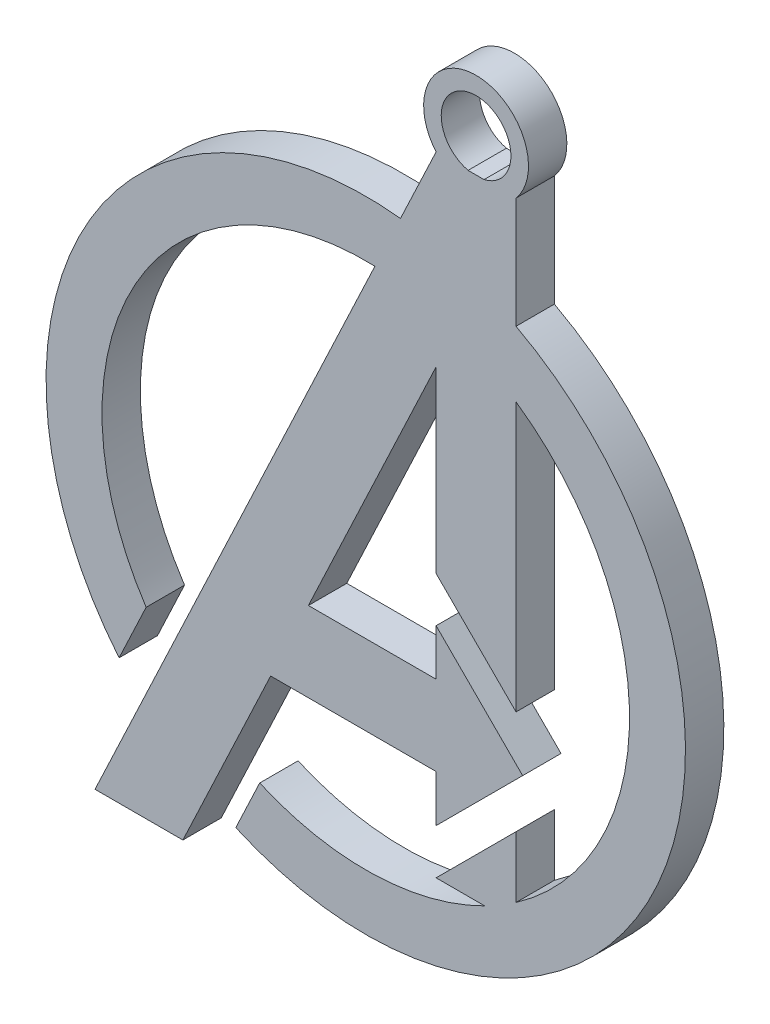
ISO-10303-21;
HEADER;
FILE_DESCRIPTION(('STEP AP214'),'2;1');
FILE_NAME('part.step','',(''),(''),'','','');
FILE_SCHEMA(('AUTOMOTIVE_DESIGN { 1 0 10303 214 1 1 1 1 }'));
ENDSEC;
DATA;
#1=APPLICATION_CONTEXT('core data for automotive mechanical design processes');
#2=APPLICATION_PROTOCOL_DEFINITION('international standard','automotive_design',2000,#1);
#3=PRODUCT_CONTEXT('',#1,'mechanical');
#4=PRODUCT('Part','Part','',(#3));
#5=PRODUCT_RELATED_PRODUCT_CATEGORY('part','',(#4));
#6=PRODUCT_DEFINITION_FORMATION('','',#4);
#7=PRODUCT_DEFINITION_CONTEXT('part definition',#1,'design');
#8=PRODUCT_DEFINITION('design','',#6,#7);
#9=PRODUCT_DEFINITION_SHAPE('','',#8);
#10=(LENGTH_UNIT() NAMED_UNIT(*) SI_UNIT(.MILLI.,.METRE.));
#11=(NAMED_UNIT(*) PLANE_ANGLE_UNIT() SI_UNIT($,.RADIAN.));
#12=(NAMED_UNIT(*) SI_UNIT($,.STERADIAN.) SOLID_ANGLE_UNIT());
#13=UNCERTAINTY_MEASURE_WITH_UNIT(LENGTH_MEASURE(1.E-05),#10,'distance_accuracy_value','');
#14=(GEOMETRIC_REPRESENTATION_CONTEXT(3) GLOBAL_UNCERTAINTY_ASSIGNED_CONTEXT((#13)) GLOBAL_UNIT_ASSIGNED_CONTEXT((#10,
#11,#12)) REPRESENTATION_CONTEXT('',''));
#15=CARTESIAN_POINT('',(0.,0.,0.));
#16=DIRECTION('',(0.,0.,1.));
#17=DIRECTION('',(1.,0.,0.));
#18=AXIS2_PLACEMENT_3D('',#15,#16,#17);
#19=CARTESIAN_POINT('',(5.588,31.242,3.048));
#20=DIRECTION('',(0.,-1.,0.));
#21=DIRECTION('',(0.,0.,-1.));
#22=AXIS2_PLACEMENT_3D('',#19,#20,#21);
#23=PLANE('',#22);
#24=DIRECTION('',(0.,0.,-1.));
#25=VECTOR('',#24,1.);
#26=CARTESIAN_POINT('',(8.128,31.242,3.048));
#27=LINE('',#26,#25);
#28=CARTESIAN_POINT('',(8.128,31.242,3.048));
#29=VERTEX_POINT('',#28);
#30=CARTESIAN_POINT('',(8.128,31.242,0.));
#31=VERTEX_POINT('',#30);
#32=EDGE_CURVE('E464',#29,#31,#27,.T.);
#33=ORIENTED_EDGE('',*,*,#32,.F.);
#34=DIRECTION('',(-1.,0.,0.));
#35=VECTOR('',#34,1.);
#36=CARTESIAN_POINT('',(5.588,31.242,3.048));
#37=LINE('',#36,#35);
#38=CARTESIAN_POINT('',(9.398,31.242,3.048));
#39=VERTEX_POINT('',#38);
#40=EDGE_CURVE('E79',#39,#29,#37,.T.);
#41=ORIENTED_EDGE('',*,*,#40,.F.);
#42=DIRECTION('',(0.,0.,-1.));
#43=VECTOR('',#42,1.);
#44=CARTESIAN_POINT('',(9.39799999999999,31.242,3.048));
#45=LINE('',#44,#43);
#46=CARTESIAN_POINT('',(9.39799999999999,31.242,0.));
#47=VERTEX_POINT('',#46);
#48=EDGE_CURVE('E467',#39,#47,#45,.T.);
#49=ORIENTED_EDGE('',*,*,#48,.T.);
#50=DIRECTION('',(-1.,0.,0.));
#51=VECTOR('',#50,1.);
#52=CARTESIAN_POINT('',(5.588,31.242,0.));
#53=LINE('',#52,#51);
#54=EDGE_CURVE('E319',#47,#31,#53,.T.);
#55=ORIENTED_EDGE('',*,*,#54,.T.);
#56=EDGE_LOOP('',(#33,#41,#49,#55));
#57=FACE_BOUND('',#56,.T.);
#58=ADVANCED_FACE('F64',(#57),#23,.F.);
#59=CARTESIAN_POINT('',(0.,0.,3.048));
#60=DIRECTION('',(0.,0.,1.));
#61=DIRECTION('',(1.,0.,0.));
#62=AXIS2_PLACEMENT_3D('',#59,#60,#61);
#63=PLANE('',#62);
#64=ORIENTED_EDGE('',*,*,#40,.T.);
#65=CARTESIAN_POINT('',(8.763,33.9375499521396,3.048));
#66=DIRECTION('',(0.,0.,-1.));
#67=DIRECTION('',(-1.,0.,0.));
#68=AXIS2_PLACEMENT_3D('',#65,#66,#67);
#69=CIRCLE('',#68,2.76933467541935);
#70=EDGE_CURVE('E263',#29,#39,#69,.T.);
#71=ORIENTED_EDGE('',*,*,#70,.T.);
#72=EDGE_LOOP('',(#64,#71));
#73=FACE_BOUND('',#72,.T.);
#74=DIRECTION('',(-0.42688750774078,-0.904304736101092,0.));
#75=VECTOR('',#74,1.);
#76=CARTESIAN_POINT('',(5.588,31.242,3.048));
#77=LINE('',#76,#75);
#78=CARTESIAN_POINT('',(0.725964665707497,20.9424210707393,3.048));
#79=VERTEX_POINT('',#78);
#80=CARTESIAN_POINT('',(-21.5102219998152,-26.162,3.048));
#81=VERTEX_POINT('',#80);
#82=EDGE_CURVE('E280',#79,#81,#77,.T.);
#83=ORIENTED_EDGE('',*,*,#82,.T.);
#84=DIRECTION('',(-1.,0.,0.));
#85=VECTOR('',#84,1.);
#86=CARTESIAN_POINT('',(2.64811640183988E-13,-26.162,3.048));
#87=LINE('',#86,#85);
#88=CARTESIAN_POINT('',(-14.5290928162455,-26.162,3.048));
#89=VERTEX_POINT('',#88);
#90=EDGE_CURVE('E461',#89,#81,#87,.T.);
#91=ORIENTED_EDGE('',*,*,#90,.F.);
#92=DIRECTION('',(0.42688750774078,0.904304736101092,0.));
#93=VECTOR('',#92,1.);
#94=CARTESIAN_POINT('',(11.2969374581526,28.5470300567194,3.048));
#95=LINE('',#94,#93);
#96=CARTESIAN_POINT('',(-7.55518868895668,-11.3887062936595,3.048));
#97=VERTEX_POINT('',#96);
#98=EDGE_CURVE('E87',#89,#97,#95,.T.);
#99=ORIENTED_EDGE('',*,*,#98,.T.);
#100=DIRECTION('',(-1.,0.,0.));
#101=VECTOR('',#100,1.);
#102=CARTESIAN_POINT('',(5.588,-11.3887062936595,3.048));
#103=LINE('',#102,#101);
#104=CARTESIAN_POINT('',(5.588,-11.3887062936595,3.048));
#105=VERTEX_POINT('',#104);
#106=EDGE_CURVE('E426',#105,#97,#103,.T.);
#107=ORIENTED_EDGE('',*,*,#106,.F.);
#108=DIRECTION('',(0.,1.,0.));
#109=VECTOR('',#108,1.);
#110=CARTESIAN_POINT('',(5.588,0.,3.048));
#111=LINE('',#110,#109);
#112=CARTESIAN_POINT('',(5.588,-15.1107057144656,3.048));
#113=VERTEX_POINT('',#112);
#114=EDGE_CURVE('E457',#113,#105,#111,.T.);
#115=ORIENTED_EDGE('',*,*,#114,.F.);
#116=DIRECTION('',(-0.707106781186547,-0.707106781186548,0.));
#117=VECTOR('',#116,1.);
#118=CARTESIAN_POINT('',(10.3493528572328,-10.3493528572328,3.048));
#119=LINE('',#118,#117);
#120=CARTESIAN_POINT('',(12.4654997104031,-8.23320600406252,3.048));
#121=VERTEX_POINT('',#120);
#122=EDGE_CURVE('E454',#121,#113,#119,.T.);
#123=ORIENTED_EDGE('',*,*,#122,.F.);
#124=DIRECTION('',(0.707106781186548,-0.707106781186548,0.));
#125=VECTOR('',#124,1.);
#126=CARTESIAN_POINT('',(2.11614685317027,2.11614685317027,3.048));
#127=LINE('',#126,#125);
#128=CARTESIAN_POINT('',(5.588,-1.35570629365946,3.048));
#129=VERTEX_POINT('',#128);
#130=EDGE_CURVE('E441',#129,#121,#127,.T.);
#131=ORIENTED_EDGE('',*,*,#130,.F.);
#132=CARTESIAN_POINT('',(5.588,-5.03870629365946,3.048));
#133=VERTEX_POINT('',#132);
#134=EDGE_CURVE('E445',#133,#129,#111,.T.);
#135=ORIENTED_EDGE('',*,*,#134,.F.);
#136=DIRECTION('',(-1.,0.,0.));
#137=VECTOR('',#136,1.);
#138=CARTESIAN_POINT('',(5.588,-5.03870629365946,3.048));
#139=LINE('',#138,#137);
#140=CARTESIAN_POINT('',(-4.55759775977358,-5.03870629365947,3.048));
#141=VERTEX_POINT('',#140);
#142=EDGE_CURVE('E418',#133,#141,#139,.T.);
#143=ORIENTED_EDGE('',*,*,#142,.T.);
#144=CARTESIAN_POINT('',(5.588,16.4534009673266,3.048));
#145=VERTEX_POINT('',#144);
#146=EDGE_CURVE('E279',#141,#145,#95,.T.);
#147=ORIENTED_EDGE('',*,*,#146,.T.);
#148=DIRECTION('',(0.,-1.,0.));
#149=VECTOR('',#148,1.);
#150=CARTESIAN_POINT('',(5.588,31.242,3.048));
#151=LINE('',#150,#149);
#152=CARTESIAN_POINT('',(5.588,2.2363961547682,3.048));
#153=VERTEX_POINT('',#152);
#154=EDGE_CURVE('E315',#145,#153,#151,.T.);
#155=ORIENTED_EDGE('',*,*,#154,.T.);
#156=DIRECTION('',(0.707106781186542,-0.707106781186553,0.));
#157=VECTOR('',#156,1.);
#158=CARTESIAN_POINT('',(5.588,2.2363961547682,3.048));
#159=LINE('',#158,#157);
#160=CARTESIAN_POINT('',(11.938,-4.11360384523191,3.048));
#161=VERTEX_POINT('',#160);
#162=EDGE_CURVE('E402',#153,#161,#159,.T.);
#163=ORIENTED_EDGE('',*,*,#162,.T.);
#164=DIRECTION('',(0.,1.,0.));
#165=VECTOR('',#164,1.);
#166=CARTESIAN_POINT('',(11.938,31.242,3.048));
#167=LINE('',#166,#165);
#168=CARTESIAN_POINT('',(11.938,17.2219679769764,3.048));
#169=VERTEX_POINT('',#168);
#170=EDGE_CURVE('E323',#161,#169,#167,.T.);
#171=ORIENTED_EDGE('',*,*,#170,.T.);
#172=CARTESIAN_POINT('',(0.,0.,3.048));
#173=DIRECTION('',(0.,0.,1.));
#174=DIRECTION('',(1.,0.,0.));
#175=AXIS2_PLACEMENT_3D('',#172,#173,#174);
#176=CIRCLE('',#175,20.955);
#177=CARTESIAN_POINT('',(11.938,-17.2219679769764,3.048));
#178=VERTEX_POINT('',#177);
#179=EDGE_CURVE('E345',#178,#169,#176,.T.);
#180=ORIENTED_EDGE('',*,*,#179,.F.);
#181=CARTESIAN_POINT('',(11.938,-12.3528081628932,3.048));
#182=VERTEX_POINT('',#181);
#183=EDGE_CURVE('E324',#178,#182,#167,.T.);
#184=ORIENTED_EDGE('',*,*,#183,.T.);
#185=DIRECTION('',(-0.707106781186553,-0.707106781186542,0.));
#186=VECTOR('',#185,1.);
#187=CARTESIAN_POINT('',(16.0576021588306,-8.23320600406261,3.048));
#188=LINE('',#187,#186);
#189=CARTESIAN_POINT('',(5.588,-18.7028081628931,3.048));
#190=VERTEX_POINT('',#189);
#191=EDGE_CURVE('E404',#182,#190,#188,.T.);
#192=ORIENTED_EDGE('',*,*,#191,.T.);
#193=DIRECTION('',(1.,0.,0.));
#194=VECTOR('',#193,1.);
#195=CARTESIAN_POINT('',(5.588,-18.7028081628931,3.048));
#196=LINE('',#195,#194);
#197=CARTESIAN_POINT('',(9.45076673196521,-18.7028081628931,3.048));
#198=VERTEX_POINT('',#197);
#199=EDGE_CURVE('E318',#190,#198,#196,.T.);
#200=ORIENTED_EDGE('',*,*,#199,.T.);
#201=CARTESIAN_POINT('',(-8.42711876384841,-19.1858201372783,3.048));
#202=VERTEX_POINT('',#201);
#203=EDGE_CURVE('E348',#202,#198,#176,.T.);
#204=ORIENTED_EDGE('',*,*,#203,.F.);
#205=DIRECTION('',(0.426887507740779,0.904304736101092,0.));
#206=VECTOR('',#205,1.);
#207=CARTESIAN_POINT('',(0.515004741694176,-0.243113943651771,3.048));
#208=LINE('',#207,#206);
#209=CARTESIAN_POINT('',(-10.3252121349415,-23.2066799514376,3.048));
#210=VERTEX_POINT('',#209);
#211=EDGE_CURVE('E307',#210,#202,#208,.T.);
#212=ORIENTED_EDGE('',*,*,#211,.F.);
#213=CARTESIAN_POINT('',(0.,0.,3.048));
#214=DIRECTION('',(0.,0.,1.));
#215=DIRECTION('',(1.,0.,0.));
#216=AXIS2_PLACEMENT_3D('',#213,#214,#215);
#217=CIRCLE('',#216,25.4);
#218=CARTESIAN_POINT('',(11.938,22.4197269385691,3.048));
#219=VERTEX_POINT('',#218);
#220=EDGE_CURVE('E357',#210,#219,#217,.T.);
#221=ORIENTED_EDGE('',*,*,#220,.T.);
#222=CARTESIAN_POINT('',(11.938,31.242,3.048));
#223=VERTEX_POINT('',#222);
#224=EDGE_CURVE('E259',#219,#223,#167,.T.);
#225=ORIENTED_EDGE('',*,*,#224,.T.);
#226=CARTESIAN_POINT('',(8.763,33.9375499521396,3.048));
#227=DIRECTION('',(0.,0.,1.));
#228=DIRECTION('',(-1.,0.,0.));
#229=AXIS2_PLACEMENT_3D('',#226,#227,#228);
#230=CIRCLE('',#229,4.16492671537928);
#231=CARTESIAN_POINT('',(5.588,31.242,3.048));
#232=VERTEX_POINT('',#231);
#233=EDGE_CURVE('E252',#223,#232,#230,.T.);
#234=ORIENTED_EDGE('',*,*,#233,.T.);
#235=CARTESIAN_POINT('',(2.7592575260228,25.2496831248451,3.048));
#236=VERTEX_POINT('',#235);
#237=EDGE_CURVE('E257',#232,#236,#77,.T.);
#238=ORIENTED_EDGE('',*,*,#237,.T.);
#239=CARTESIAN_POINT('',(-19.5970259534367,-16.1591018865632,3.048));
#240=VERTEX_POINT('',#239);
#241=EDGE_CURVE('E354',#236,#240,#217,.T.);
#242=ORIENTED_EDGE('',*,*,#241,.T.);
#243=DIRECTION('',(0.42688750774078,0.904304736101092,0.));
#244=VECTOR('',#243,1.);
#245=CARTESIAN_POINT('',(-9.78780077585193,4.62044453895197,3.048));
#246=LINE('',#245,#244);
#247=CARTESIAN_POINT('',(-17.4475768457148,-11.6057781821331,3.048));
#248=VERTEX_POINT('',#247);
#249=EDGE_CURVE('E298',#240,#248,#246,.T.);
#250=ORIENTED_EDGE('',*,*,#249,.T.);
#251=EDGE_CURVE('E350',#79,#248,#176,.T.);
#252=ORIENTED_EDGE('',*,*,#251,.F.);
#253=EDGE_LOOP('',(#83,#91,#99,#107,#115,#123,#131,#135,#143,#147,#155,#163,#171,#180,#184,#192,
#200,#204,#212,#221,#225,#234,#238,#242,#250,#252));
#254=FACE_BOUND('',#253,.T.);
#255=ADVANCED_FACE('F255',(#73,#254),#63,.T.);
#256=CARTESIAN_POINT('',(0.,0.,0.));
#257=DIRECTION('',(0.,0.,1.));
#258=DIRECTION('',(1.,0.,0.));
#259=AXIS2_PLACEMENT_3D('',#256,#257,#258);
#260=PLANE('',#259);
#261=CARTESIAN_POINT('',(8.763,33.9375499521396,0.));
#262=DIRECTION('',(0.,0.,-1.));
#263=DIRECTION('',(-1.,0.,0.));
#264=AXIS2_PLACEMENT_3D('',#261,#262,#263);
#265=CIRCLE('',#264,2.76933467541935);
#266=EDGE_CURVE('E264',#31,#47,#265,.T.);
#267=ORIENTED_EDGE('',*,*,#266,.F.);
#268=ORIENTED_EDGE('',*,*,#54,.F.);
#269=EDGE_LOOP('',(#267,#268));
#270=FACE_BOUND('',#269,.T.);
#271=DIRECTION('',(-1.,0.,0.));
#272=VECTOR('',#271,1.);
#273=CARTESIAN_POINT('',(2.64811640183988E-13,-26.162,0.));
#274=LINE('',#273,#272);
#275=CARTESIAN_POINT('',(-14.5290928162455,-26.162,0.));
#276=VERTEX_POINT('',#275);
#277=CARTESIAN_POINT('',(-21.5102219998152,-26.162,0.));
#278=VERTEX_POINT('',#277);
#279=EDGE_CURVE('E462',#276,#278,#274,.T.);
#280=ORIENTED_EDGE('',*,*,#279,.T.);
#281=DIRECTION('',(-0.42688750774078,-0.904304736101092,0.));
#282=VECTOR('',#281,1.);
#283=CARTESIAN_POINT('',(5.588,31.242,0.));
#284=LINE('',#283,#282);
#285=CARTESIAN_POINT('',(0.725964665707497,20.9424210707393,0.));
#286=VERTEX_POINT('',#285);
#287=EDGE_CURVE('E292',#286,#278,#284,.T.);
#288=ORIENTED_EDGE('',*,*,#287,.F.);
#289=CARTESIAN_POINT('',(0.,0.,0.));
#290=DIRECTION('',(0.,0.,1.));
#291=DIRECTION('',(1.,0.,0.));
#292=AXIS2_PLACEMENT_3D('',#289,#290,#291);
#293=CIRCLE('',#292,20.955);
#294=CARTESIAN_POINT('',(-17.4475768457148,-11.6057781821331,0.));
#295=VERTEX_POINT('',#294);
#296=EDGE_CURVE('E349',#286,#295,#293,.T.);
#297=ORIENTED_EDGE('',*,*,#296,.T.);
#298=DIRECTION('',(0.42688750774078,0.904304736101092,0.));
#299=VECTOR('',#298,1.);
#300=CARTESIAN_POINT('',(-9.78780077585193,4.62044453895197,0.));
#301=LINE('',#300,#299);
#302=CARTESIAN_POINT('',(-19.5970259534367,-16.1591018865632,0.));
#303=VERTEX_POINT('',#302);
#304=EDGE_CURVE('E369',#303,#295,#301,.T.);
#305=ORIENTED_EDGE('',*,*,#304,.F.);
#306=CARTESIAN_POINT('',(0.,0.,0.));
#307=DIRECTION('',(0.,0.,1.));
#308=DIRECTION('',(1.,0.,0.));
#309=AXIS2_PLACEMENT_3D('',#306,#307,#308);
#310=CIRCLE('',#309,25.4);
#311=CARTESIAN_POINT('',(2.7592575260228,25.2496831248451,0.));
#312=VERTEX_POINT('',#311);
#313=EDGE_CURVE('E358',#312,#303,#310,.T.);
#314=ORIENTED_EDGE('',*,*,#313,.F.);
#315=CARTESIAN_POINT('',(5.588,31.242,0.));
#316=VERTEX_POINT('',#315);
#317=EDGE_CURVE('E289',#316,#312,#284,.T.);
#318=ORIENTED_EDGE('',*,*,#317,.F.);
#319=CARTESIAN_POINT('',(8.763,33.9375499521396,0.));
#320=DIRECTION('',(0.,0.,1.));
#321=DIRECTION('',(-1.,0.,0.));
#322=AXIS2_PLACEMENT_3D('',#319,#320,#321);
#323=CIRCLE('',#322,4.16492671537928);
#324=CARTESIAN_POINT('',(11.938,31.242,0.));
#325=VERTEX_POINT('',#324);
#326=EDGE_CURVE('E270',#325,#316,#323,.T.);
#327=ORIENTED_EDGE('',*,*,#326,.F.);
#328=DIRECTION('',(0.,1.,0.));
#329=VECTOR('',#328,1.);
#330=CARTESIAN_POINT('',(11.938,31.242,0.));
#331=LINE('',#330,#329);
#332=CARTESIAN_POINT('',(11.938,22.4197269385691,0.));
#333=VERTEX_POINT('',#332);
#334=EDGE_CURVE('E331',#333,#325,#331,.T.);
#335=ORIENTED_EDGE('',*,*,#334,.F.);
#336=CARTESIAN_POINT('',(-10.3252121349415,-23.2066799514376,0.));
#337=VERTEX_POINT('',#336);
#338=EDGE_CURVE('E360',#337,#333,#310,.T.);
#339=ORIENTED_EDGE('',*,*,#338,.F.);
#340=DIRECTION('',(0.426887507740779,0.904304736101092,0.));
#341=VECTOR('',#340,1.);
#342=CARTESIAN_POINT('',(0.515004741694176,-0.243113943651771,0.));
#343=LINE('',#342,#341);
#344=CARTESIAN_POINT('',(-8.42711876384841,-19.1858201372783,0.));
#345=VERTEX_POINT('',#344);
#346=EDGE_CURVE('E372',#337,#345,#343,.T.);
#347=ORIENTED_EDGE('',*,*,#346,.T.);
#348=CARTESIAN_POINT('',(9.45076673196521,-18.7028081628931,0.));
#349=VERTEX_POINT('',#348);
#350=EDGE_CURVE('E353',#345,#349,#293,.T.);
#351=ORIENTED_EDGE('',*,*,#350,.T.);
#352=DIRECTION('',(1.,0.,0.));
#353=VECTOR('',#352,1.);
#354=CARTESIAN_POINT('',(5.588,-18.7028081628931,0.));
#355=LINE('',#354,#353);
#356=CARTESIAN_POINT('',(5.588,-18.7028081628931,0.));
#357=VERTEX_POINT('',#356);
#358=EDGE_CURVE('E328',#357,#349,#355,.T.);
#359=ORIENTED_EDGE('',*,*,#358,.F.);
#360=DIRECTION('',(-0.707106781186553,-0.707106781186542,0.));
#361=VECTOR('',#360,1.);
#362=CARTESIAN_POINT('',(16.0576021588306,-8.23320600406261,0.));
#363=LINE('',#362,#361);
#364=CARTESIAN_POINT('',(11.938,-12.3528081628932,0.));
#365=VERTEX_POINT('',#364);
#366=EDGE_CURVE('E400',#365,#357,#363,.T.);
#367=ORIENTED_EDGE('',*,*,#366,.F.);
#368=CARTESIAN_POINT('',(11.938,-17.2219679769764,0.));
#369=VERTEX_POINT('',#368);
#370=EDGE_CURVE('E334',#369,#365,#331,.T.);
#371=ORIENTED_EDGE('',*,*,#370,.F.);
#372=CARTESIAN_POINT('',(11.938,17.2219679769764,0.));
#373=VERTEX_POINT('',#372);
#374=EDGE_CURVE('E344',#369,#373,#293,.T.);
#375=ORIENTED_EDGE('',*,*,#374,.T.);
#376=CARTESIAN_POINT('',(11.938,-4.11360384523189,0.));
#377=VERTEX_POINT('',#376);
#378=EDGE_CURVE('E333',#377,#373,#331,.T.);
#379=ORIENTED_EDGE('',*,*,#378,.F.);
#380=DIRECTION('',(0.707106781186542,-0.707106781186553,0.));
#381=VECTOR('',#380,1.);
#382=CARTESIAN_POINT('',(5.588,2.2363961547682,0.));
#383=LINE('',#382,#381);
#384=CARTESIAN_POINT('',(5.588,2.2363961547682,0.));
#385=VERTEX_POINT('',#384);
#386=EDGE_CURVE('E390',#385,#377,#383,.T.);
#387=ORIENTED_EDGE('',*,*,#386,.F.);
#388=DIRECTION('',(0.,-1.,0.));
#389=VECTOR('',#388,1.);
#390=CARTESIAN_POINT('',(5.588,31.242,0.));
#391=LINE('',#390,#389);
#392=CARTESIAN_POINT('',(5.588,16.4534009673266,0.));
#393=VERTEX_POINT('',#392);
#394=EDGE_CURVE('E314',#393,#385,#391,.T.);
#395=ORIENTED_EDGE('',*,*,#394,.F.);
#396=DIRECTION('',(0.42688750774078,0.904304736101092,0.));
#397=VECTOR('',#396,1.);
#398=CARTESIAN_POINT('',(11.2969374581526,28.5470300567194,0.));
#399=LINE('',#398,#397);
#400=CARTESIAN_POINT('',(-4.55759775977358,-5.03870629365947,0.));
#401=VERTEX_POINT('',#400);
#402=EDGE_CURVE('E291',#401,#393,#399,.T.);
#403=ORIENTED_EDGE('',*,*,#402,.F.);
#404=DIRECTION('',(-1.,0.,0.));
#405=VECTOR('',#404,1.);
#406=CARTESIAN_POINT('',(5.588,-5.03870629365946,0.));
#407=LINE('',#406,#405);
#408=CARTESIAN_POINT('',(5.588,-5.03870629365946,0.));
#409=VERTEX_POINT('',#408);
#410=EDGE_CURVE('E423',#409,#401,#407,.T.);
#411=ORIENTED_EDGE('',*,*,#410,.F.);
#412=DIRECTION('',(0.,1.,0.));
#413=VECTOR('',#412,1.);
#414=CARTESIAN_POINT('',(5.588,0.,0.));
#415=LINE('',#414,#413);
#416=CARTESIAN_POINT('',(5.588,-1.35570629365946,0.));
#417=VERTEX_POINT('',#416);
#418=EDGE_CURVE('E417',#409,#417,#415,.T.);
#419=ORIENTED_EDGE('',*,*,#418,.T.);
#420=DIRECTION('',(0.707106781186548,-0.707106781186548,0.));
#421=VECTOR('',#420,1.);
#422=CARTESIAN_POINT('',(2.11614685317027,2.11614685317027,0.));
#423=LINE('',#422,#421);
#424=CARTESIAN_POINT('',(12.4654997104031,-8.23320600406252,0.));
#425=VERTEX_POINT('',#424);
#426=EDGE_CURVE('E442',#417,#425,#423,.T.);
#427=ORIENTED_EDGE('',*,*,#426,.T.);
#428=DIRECTION('',(-0.707106781186547,-0.707106781186548,0.));
#429=VECTOR('',#428,1.);
#430=CARTESIAN_POINT('',(10.3493528572328,-10.3493528572328,0.));
#431=LINE('',#430,#429);
#432=CARTESIAN_POINT('',(5.588,-15.1107057144656,0.));
#433=VERTEX_POINT('',#432);
#434=EDGE_CURVE('E446',#425,#433,#431,.T.);
#435=ORIENTED_EDGE('',*,*,#434,.T.);
#436=CARTESIAN_POINT('',(5.588,-11.3887062936595,0.));
#437=VERTEX_POINT('',#436);
#438=EDGE_CURVE('E449',#433,#437,#415,.T.);
#439=ORIENTED_EDGE('',*,*,#438,.T.);
#440=DIRECTION('',(-1.,0.,0.));
#441=VECTOR('',#440,1.);
#442=CARTESIAN_POINT('',(5.588,-11.3887062936595,0.));
#443=LINE('',#442,#441);
#444=CARTESIAN_POINT('',(-7.55518868895668,-11.3887062936595,0.));
#445=VERTEX_POINT('',#444);
#446=EDGE_CURVE('E427',#437,#445,#443,.T.);
#447=ORIENTED_EDGE('',*,*,#446,.T.);
#448=EDGE_CURVE('E283',#276,#445,#399,.T.);
#449=ORIENTED_EDGE('',*,*,#448,.F.);
#450=EDGE_LOOP('',(#280,#288,#297,#305,#314,#318,#327,#335,#339,#347,#351,#359,#367,#371,#375,
#379,#387,#395,#403,#411,#419,#427,#435,#439,#447,#449));
#451=FACE_BOUND('',#450,.T.);
#452=ADVANCED_FACE('F388',(#270,#451),#260,.F.);
#453=CARTESIAN_POINT('',(11.2969374581526,28.5470300567194,3.048));
#454=DIRECTION('',(-0.904304736101092,0.42688750774078,0.));
#455=DIRECTION('',(-0.42688750774078,-0.904304736101092,0.));
#456=AXIS2_PLACEMENT_3D('',#453,#454,#455);
#457=PLANE('',#456);
#458=DIRECTION('',(0.,0.,1.));
#459=VECTOR('',#458,1.);
#460=CARTESIAN_POINT('',(-14.5290928162455,-26.162,3.048));
#461=LINE('',#460,#459);
#462=EDGE_CURVE('E430',#276,#89,#461,.T.);
#463=ORIENTED_EDGE('',*,*,#462,.F.);
#464=ORIENTED_EDGE('',*,*,#448,.T.);
#465=DIRECTION('',(0.,0.,-1.));
#466=VECTOR('',#465,1.);
#467=CARTESIAN_POINT('',(-7.55518868895668,-11.3887062936595,3.048));
#468=LINE('',#467,#466);
#469=EDGE_CURVE('E414',#97,#445,#468,.T.);
#470=ORIENTED_EDGE('',*,*,#469,.F.);
#471=ORIENTED_EDGE('',*,*,#98,.F.);
#472=EDGE_LOOP('',(#463,#464,#470,#471));
#473=FACE_BOUND('',#472,.T.);
#474=ADVANCED_FACE('F479',(#473),#457,.F.);
#475=DIRECTION('',(0.,0.,1.));
#476=VECTOR('',#475,1.);
#477=CARTESIAN_POINT('',(-4.55759775977358,-5.03870629365947,3.048));
#478=LINE('',#477,#476);
#479=EDGE_CURVE('E12',#401,#141,#478,.T.);
#480=ORIENTED_EDGE('',*,*,#479,.F.);
#481=ORIENTED_EDGE('',*,*,#402,.T.);
#482=DIRECTION('',(0.,0.,1.));
#483=VECTOR('',#482,1.);
#484=CARTESIAN_POINT('',(5.588,16.4534009673266,3.048));
#485=LINE('',#484,#483);
#486=EDGE_CURVE('E375',#393,#145,#485,.T.);
#487=ORIENTED_EDGE('',*,*,#486,.T.);
#488=ORIENTED_EDGE('',*,*,#146,.F.);
#489=EDGE_LOOP('',(#480,#481,#487,#488));
#490=FACE_BOUND('',#489,.T.);
#491=ADVANCED_FACE('F484',(#490),#457,.F.);
#492=CARTESIAN_POINT('',(11.938,31.242,3.048));
#493=DIRECTION('',(-1.,0.,0.));
#494=DIRECTION('',(0.,-1.,0.));
#495=AXIS2_PLACEMENT_3D('',#492,#493,#494);
#496=PLANE('',#495);
#497=ORIENTED_EDGE('',*,*,#170,.F.);
#498=DIRECTION('',(0.,0.,-1.));
#499=VECTOR('',#498,1.);
#500=CARTESIAN_POINT('',(11.938,-4.11360384523191,3.048));
#501=LINE('',#500,#499);
#502=EDGE_CURVE('E72',#161,#377,#501,.T.);
#503=ORIENTED_EDGE('',*,*,#502,.T.);
#504=ORIENTED_EDGE('',*,*,#378,.T.);
#505=DIRECTION('',(0.,0.,-1.));
#506=VECTOR('',#505,1.);
#507=CARTESIAN_POINT('',(11.938,17.2219679769764,3.048));
#508=LINE('',#507,#506);
#509=EDGE_CURVE('E363',#169,#373,#508,.T.);
#510=ORIENTED_EDGE('',*,*,#509,.F.);
#511=EDGE_LOOP('',(#497,#503,#504,#510));
#512=FACE_BOUND('',#511,.T.);
#513=ADVANCED_FACE('F381',(#512),#496,.F.);
#514=CARTESIAN_POINT('',(0.,0.,3.048));
#515=DIRECTION('',(0.,0.,-1.));
#516=DIRECTION('',(-1.,0.,0.));
#517=AXIS2_PLACEMENT_3D('',#514,#515,#516);
#518=CYLINDRICAL_SURFACE('',#517,25.4);
#519=DIRECTION('',(0.,0.,-1.));
#520=VECTOR('',#519,1.);
#521=CARTESIAN_POINT('',(2.7592575260228,25.2496831248451,3.048));
#522=LINE('',#521,#520);
#523=EDGE_CURVE('E278',#312,#236,#522,.F.);
#524=ORIENTED_EDGE('',*,*,#523,.F.);
#525=ORIENTED_EDGE('',*,*,#313,.T.);
#526=DIRECTION('',(0.,0.,-1.));
#527=VECTOR('',#526,1.);
#528=CARTESIAN_POINT('',(-19.5970259534367,-16.1591018865632,3.048));
#529=LINE('',#528,#527);
#530=EDGE_CURVE('E304',#240,#303,#529,.T.);
#531=ORIENTED_EDGE('',*,*,#530,.F.);
#532=ORIENTED_EDGE('',*,*,#241,.F.);
#533=EDGE_LOOP('',(#524,#525,#531,#532));
#534=FACE_BOUND('',#533,.T.);
#535=ADVANCED_FACE('F518',(#534),#518,.T.);
#536=CARTESIAN_POINT('',(0.,0.,3.048));
#537=DIRECTION('',(0.,0.,-1.));
#538=DIRECTION('',(-1.,0.,0.));
#539=AXIS2_PLACEMENT_3D('',#536,#537,#538);
#540=CYLINDRICAL_SURFACE('',#539,20.955);
#541=ORIENTED_EDGE('',*,*,#296,.F.);
#542=DIRECTION('',(0.,0.,-1.));
#543=VECTOR('',#542,1.);
#544=CARTESIAN_POINT('',(0.725964665707498,20.9424210707393,3.048));
#545=LINE('',#544,#543);
#546=EDGE_CURVE('E295',#286,#79,#545,.F.);
#547=ORIENTED_EDGE('',*,*,#546,.T.);
#548=ORIENTED_EDGE('',*,*,#251,.T.);
#549=DIRECTION('',(0.,0.,-1.));
#550=VECTOR('',#549,1.);
#551=CARTESIAN_POINT('',(-17.4475768457148,-11.6057781821331,3.048));
#552=LINE('',#551,#550);
#553=EDGE_CURVE('E301',#248,#295,#552,.T.);
#554=ORIENTED_EDGE('',*,*,#553,.T.);
#555=EDGE_LOOP('',(#541,#547,#548,#554));
#556=FACE_BOUND('',#555,.T.);
#557=ADVANCED_FACE('F507',(#556),#540,.F.);
#558=CARTESIAN_POINT('',(5.588,31.242,3.048));
#559=DIRECTION('',(1.,0.,0.));
#560=DIRECTION('',(0.,1.,0.));
#561=AXIS2_PLACEMENT_3D('',#558,#559,#560);
#562=PLANE('',#561);
#563=ORIENTED_EDGE('',*,*,#394,.T.);
#564=DIRECTION('',(0.,0.,-1.));
#565=VECTOR('',#564,1.);
#566=CARTESIAN_POINT('',(5.588,2.2363961547682,3.048));
#567=LINE('',#566,#565);
#568=EDGE_CURVE('E409',#153,#385,#567,.T.);
#569=ORIENTED_EDGE('',*,*,#568,.F.);
#570=ORIENTED_EDGE('',*,*,#154,.F.);
#571=ORIENTED_EDGE('',*,*,#486,.F.);
#572=EDGE_LOOP('',(#563,#569,#570,#571));
#573=FACE_BOUND('',#572,.T.);
#574=ADVANCED_FACE('F504',(#573),#562,.F.);
#575=ORIENTED_EDGE('',*,*,#220,.F.);
#576=DIRECTION('',(0.,0.,-1.));
#577=VECTOR('',#576,1.);
#578=CARTESIAN_POINT('',(-10.3252121349415,-23.2066799514376,3.048));
#579=LINE('',#578,#577);
#580=EDGE_CURVE('E311',#210,#337,#579,.T.);
#581=ORIENTED_EDGE('',*,*,#580,.T.);
#582=ORIENTED_EDGE('',*,*,#338,.T.);
#583=DIRECTION('',(0.,0.,-1.));
#584=VECTOR('',#583,1.);
#585=CARTESIAN_POINT('',(11.938,22.4197269385691,3.048));
#586=LINE('',#585,#584);
#587=EDGE_CURVE('E341',#219,#333,#586,.T.);
#588=ORIENTED_EDGE('',*,*,#587,.F.);
#589=EDGE_LOOP('',(#575,#581,#582,#588));
#590=FACE_BOUND('',#589,.T.);
#591=ADVANCED_FACE('F66',(#590),#518,.T.);
#592=DIRECTION('',(0.,0.,-1.));
#593=VECTOR('',#592,1.);
#594=CARTESIAN_POINT('',(-8.42711876384841,-19.1858201372783,3.048));
#595=LINE('',#594,#593);
#596=EDGE_CURVE('E309',#202,#345,#595,.T.);
#597=ORIENTED_EDGE('',*,*,#596,.F.);
#598=ORIENTED_EDGE('',*,*,#203,.T.);
#599=DIRECTION('',(0.,0.,-1.));
#600=VECTOR('',#599,1.);
#601=CARTESIAN_POINT('',(9.45076673196521,-18.7028081628931,3.048));
#602=LINE('',#601,#600);
#603=EDGE_CURVE('E366',#198,#349,#602,.T.);
#604=ORIENTED_EDGE('',*,*,#603,.T.);
#605=ORIENTED_EDGE('',*,*,#350,.F.);
#606=EDGE_LOOP('',(#597,#598,#604,#605));
#607=FACE_BOUND('',#606,.T.);
#608=ADVANCED_FACE('F509',(#607),#540,.F.);
#609=ORIENTED_EDGE('',*,*,#179,.T.);
#610=ORIENTED_EDGE('',*,*,#509,.T.);
#611=ORIENTED_EDGE('',*,*,#374,.F.);
#612=DIRECTION('',(0.,0.,-1.));
#613=VECTOR('',#612,1.);
#614=CARTESIAN_POINT('',(11.938,-17.2219679769764,3.048));
#615=LINE('',#614,#613);
#616=EDGE_CURVE('E356',#369,#178,#615,.F.);
#617=ORIENTED_EDGE('',*,*,#616,.T.);
#618=EDGE_LOOP('',(#609,#610,#611,#617));
#619=FACE_BOUND('',#618,.T.);
#620=ADVANCED_FACE('F499',(#619),#540,.F.);
#621=ORIENTED_EDGE('',*,*,#370,.T.);
#622=DIRECTION('',(0.,0.,1.));
#623=VECTOR('',#622,1.);
#624=CARTESIAN_POINT('',(11.938,-12.3528081628932,3.048));
#625=LINE('',#624,#623);
#626=EDGE_CURVE('E285',#365,#182,#625,.T.);
#627=ORIENTED_EDGE('',*,*,#626,.T.);
#628=ORIENTED_EDGE('',*,*,#183,.F.);
#629=ORIENTED_EDGE('',*,*,#616,.F.);
#630=EDGE_LOOP('',(#621,#627,#628,#629));
#631=FACE_BOUND('',#630,.T.);
#632=ADVANCED_FACE('F396',(#631),#496,.F.);
#633=CARTESIAN_POINT('',(5.588,-18.7028081628931,3.048));
#634=DIRECTION('',(0.,1.,0.));
#635=DIRECTION('',(0.,0.,1.));
#636=AXIS2_PLACEMENT_3D('',#633,#634,#635);
#637=PLANE('',#636);
#638=ORIENTED_EDGE('',*,*,#603,.F.);
#639=ORIENTED_EDGE('',*,*,#199,.F.);
#640=DIRECTION('',(0.,0.,-1.));
#641=VECTOR('',#640,1.);
#642=CARTESIAN_POINT('',(5.588,-18.7028081628931,3.048));
#643=LINE('',#642,#641);
#644=EDGE_CURVE('E338',#190,#357,#643,.T.);
#645=ORIENTED_EDGE('',*,*,#644,.T.);
#646=ORIENTED_EDGE('',*,*,#358,.T.);
#647=EDGE_LOOP('',(#638,#639,#645,#646));
#648=FACE_BOUND('',#647,.T.);
#649=ADVANCED_FACE('F498',(#648),#637,.F.);
#650=ORIENTED_EDGE('',*,*,#224,.F.);
#651=ORIENTED_EDGE('',*,*,#587,.T.);
#652=ORIENTED_EDGE('',*,*,#334,.T.);
#653=DIRECTION('',(0.,0.,-1.));
#654=VECTOR('',#653,1.);
#655=CARTESIAN_POINT('',(11.938,31.242,3.048));
#656=LINE('',#655,#654);
#657=EDGE_CURVE('E274',#223,#325,#656,.T.);
#658=ORIENTED_EDGE('',*,*,#657,.F.);
#659=EDGE_LOOP('',(#650,#651,#652,#658));
#660=FACE_BOUND('',#659,.T.);
#661=ADVANCED_FACE('F500',(#660),#496,.F.);
#662=CARTESIAN_POINT('',(-11.8822552025502,0.183619794103185,3.302));
#663=DIRECTION('',(0.904304736101092,-0.42688750774078,0.));
#664=DIRECTION('',(0.42688750774078,0.904304736101092,0.));
#665=AXIS2_PLACEMENT_3D('',#662,#663,#664);
#666=PLANE('',#665);
#667=ORIENTED_EDGE('',*,*,#530,.T.);
#668=ORIENTED_EDGE('',*,*,#304,.T.);
#669=ORIENTED_EDGE('',*,*,#553,.F.);
#670=ORIENTED_EDGE('',*,*,#249,.F.);
#671=EDGE_LOOP('',(#667,#668,#669,#670));
#672=FACE_BOUND('',#671,.T.);
#673=ADVANCED_FACE('F582',(#672),#666,.T.);
#674=CARTESIAN_POINT('',(-1.57944968500407,-4.67993868850056,3.302));
#675=DIRECTION('',(0.904304736101092,-0.426887507740779,0.));
#676=DIRECTION('',(0.426887507740779,0.904304736101092,0.));
#677=AXIS2_PLACEMENT_3D('',#674,#675,#676);
#678=PLANE('',#677);
#679=ORIENTED_EDGE('',*,*,#211,.T.);
#680=ORIENTED_EDGE('',*,*,#596,.T.);
#681=ORIENTED_EDGE('',*,*,#346,.F.);
#682=ORIENTED_EDGE('',*,*,#580,.F.);
#683=EDGE_LOOP('',(#679,#680,#681,#682));
#684=FACE_BOUND('',#683,.T.);
#685=ADVANCED_FACE('F494',(#684),#678,.F.);
#686=CARTESIAN_POINT('',(5.588,31.242,3.048));
#687=DIRECTION('',(0.904304736101092,-0.42688750774078,0.));
#688=DIRECTION('',(0.42688750774078,0.904304736101092,0.));
#689=AXIS2_PLACEMENT_3D('',#686,#687,#688);
#690=PLANE('',#689);
#691=ORIENTED_EDGE('',*,*,#317,.T.);
#692=ORIENTED_EDGE('',*,*,#523,.T.);
#693=ORIENTED_EDGE('',*,*,#237,.F.);
#694=DIRECTION('',(0.,0.,-1.));
#695=VECTOR('',#694,1.);
#696=CARTESIAN_POINT('',(5.588,31.242,3.048));
#697=LINE('',#696,#695);
#698=EDGE_CURVE('E267',#232,#316,#697,.T.);
#699=ORIENTED_EDGE('',*,*,#698,.T.);
#700=EDGE_LOOP('',(#691,#692,#693,#699));
#701=FACE_BOUND('',#700,.T.);
#702=ADVANCED_FACE('F277',(#701),#690,.F.);
#703=ORIENTED_EDGE('',*,*,#546,.F.);
#704=ORIENTED_EDGE('',*,*,#287,.T.);
#705=DIRECTION('',(0.,0.,-1.));
#706=VECTOR('',#705,1.);
#707=CARTESIAN_POINT('',(-21.5102219998152,-26.162,3.048));
#708=LINE('',#707,#706);
#709=EDGE_CURVE('E288',#81,#278,#708,.T.);
#710=ORIENTED_EDGE('',*,*,#709,.F.);
#711=ORIENTED_EDGE('',*,*,#82,.F.);
#712=EDGE_LOOP('',(#703,#704,#710,#711));
#713=FACE_BOUND('',#712,.T.);
#714=ADVANCED_FACE('F534',(#713),#690,.F.);
#715=CARTESIAN_POINT('',(16.0576021588306,-8.23320600406261,3.048));
#716=DIRECTION('',(0.707106781186542,-0.707106781186553,0.));
#717=DIRECTION('',(0.707106781186553,0.707106781186542,0.));
#718=AXIS2_PLACEMENT_3D('',#715,#716,#717);
#719=PLANE('',#718);
#720=ORIENTED_EDGE('',*,*,#366,.T.);
#721=ORIENTED_EDGE('',*,*,#644,.F.);
#722=ORIENTED_EDGE('',*,*,#191,.F.);
#723=ORIENTED_EDGE('',*,*,#626,.F.);
#724=EDGE_LOOP('',(#720,#721,#722,#723));
#725=FACE_BOUND('',#724,.T.);
#726=ADVANCED_FACE('F571',(#725),#719,.F.);
#727=CARTESIAN_POINT('',(5.588,2.2363961547682,3.048));
#728=DIRECTION('',(0.707106781186553,0.707106781186542,0.));
#729=DIRECTION('',(-0.707106781186542,0.707106781186553,0.));
#730=AXIS2_PLACEMENT_3D('',#727,#728,#729);
#731=PLANE('',#730);
#732=ORIENTED_EDGE('',*,*,#162,.F.);
#733=ORIENTED_EDGE('',*,*,#568,.T.);
#734=ORIENTED_EDGE('',*,*,#386,.T.);
#735=ORIENTED_EDGE('',*,*,#502,.F.);
#736=EDGE_LOOP('',(#732,#733,#734,#735));
#737=FACE_BOUND('',#736,.T.);
#738=ADVANCED_FACE('F569',(#737),#731,.F.);
#739=CARTESIAN_POINT('',(5.588,-5.03870629365946,3.048));
#740=DIRECTION('',(0.,-1.,0.));
#741=DIRECTION('',(1.,0.,0.));
#742=AXIS2_PLACEMENT_3D('',#739,#740,#741);
#743=PLANE('',#742);
#744=ORIENTED_EDGE('',*,*,#410,.T.);
#745=ORIENTED_EDGE('',*,*,#479,.T.);
#746=ORIENTED_EDGE('',*,*,#142,.F.);
#747=DIRECTION('',(0.,0.,-1.));
#748=VECTOR('',#747,1.);
#749=CARTESIAN_POINT('',(5.588,-5.03870629365946,3.048));
#750=LINE('',#749,#748);
#751=EDGE_CURVE('E406',#133,#409,#750,.T.);
#752=ORIENTED_EDGE('',*,*,#751,.T.);
#753=EDGE_LOOP('',(#744,#745,#746,#752));
#754=FACE_BOUND('',#753,.T.);
#755=ADVANCED_FACE('F563',(#754),#743,.F.);
#756=CARTESIAN_POINT('',(2.11614685317027,2.11614685317027,3.048));
#757=DIRECTION('',(0.707106781186548,0.707106781186548,0.));
#758=DIRECTION('',(-0.707106781186548,0.707106781186548,0.));
#759=AXIS2_PLACEMENT_3D('',#756,#757,#758);
#760=PLANE('',#759);
#761=ORIENTED_EDGE('',*,*,#426,.F.);
#762=DIRECTION('',(0.,0.,-1.));
#763=VECTOR('',#762,1.);
#764=CARTESIAN_POINT('',(5.588,-1.35570629365946,3.048));
#765=LINE('',#764,#763);
#766=EDGE_CURVE('E438',#129,#417,#765,.T.);
#767=ORIENTED_EDGE('',*,*,#766,.F.);
#768=ORIENTED_EDGE('',*,*,#130,.T.);
#769=DIRECTION('',(0.,0.,-1.));
#770=VECTOR('',#769,1.);
#771=CARTESIAN_POINT('',(12.4654997104031,-8.23320600406252,3.048));
#772=LINE('',#771,#770);
#773=EDGE_CURVE('E436',#121,#425,#772,.T.);
#774=ORIENTED_EDGE('',*,*,#773,.T.);
#775=EDGE_LOOP('',(#761,#767,#768,#774));
#776=FACE_BOUND('',#775,.T.);
#777=ADVANCED_FACE('F556',(#776),#760,.T.);
#778=CARTESIAN_POINT('',(10.3493528572328,-10.3493528572328,3.048));
#779=DIRECTION('',(0.707106781186548,-0.707106781186547,0.));
#780=DIRECTION('',(0.707106781186547,0.707106781186548,0.));
#781=AXIS2_PLACEMENT_3D('',#778,#779,#780);
#782=PLANE('',#781);
#783=ORIENTED_EDGE('',*,*,#434,.F.);
#784=ORIENTED_EDGE('',*,*,#773,.F.);
#785=ORIENTED_EDGE('',*,*,#122,.T.);
#786=DIRECTION('',(0.,0.,-1.));
#787=VECTOR('',#786,1.);
#788=CARTESIAN_POINT('',(5.588,-15.1107057144656,3.048));
#789=LINE('',#788,#787);
#790=EDGE_CURVE('E422',#113,#433,#789,.T.);
#791=ORIENTED_EDGE('',*,*,#790,.T.);
#792=EDGE_LOOP('',(#783,#784,#785,#791));
#793=FACE_BOUND('',#792,.T.);
#794=ADVANCED_FACE('F550',(#793),#782,.T.);
#795=CARTESIAN_POINT('',(5.588,0.,3.048));
#796=DIRECTION('',(-1.,0.,0.));
#797=DIRECTION('',(0.,0.,1.));
#798=AXIS2_PLACEMENT_3D('',#795,#796,#797);
#799=PLANE('',#798);
#800=ORIENTED_EDGE('',*,*,#114,.T.);
#801=DIRECTION('',(0.,0.,-1.));
#802=VECTOR('',#801,1.);
#803=CARTESIAN_POINT('',(5.588,-11.3887062936595,3.048));
#804=LINE('',#803,#802);
#805=EDGE_CURVE('E420',#105,#437,#804,.T.);
#806=ORIENTED_EDGE('',*,*,#805,.T.);
#807=ORIENTED_EDGE('',*,*,#438,.F.);
#808=ORIENTED_EDGE('',*,*,#790,.F.);
#809=EDGE_LOOP('',(#800,#806,#807,#808));
#810=FACE_BOUND('',#809,.T.);
#811=ADVANCED_FACE('F546',(#810),#799,.T.);
#812=ORIENTED_EDGE('',*,*,#751,.F.);
#813=ORIENTED_EDGE('',*,*,#134,.T.);
#814=ORIENTED_EDGE('',*,*,#766,.T.);
#815=ORIENTED_EDGE('',*,*,#418,.F.);
#816=EDGE_LOOP('',(#812,#813,#814,#815));
#817=FACE_BOUND('',#816,.T.);
#818=ADVANCED_FACE('F559',(#817),#799,.T.);
#819=CARTESIAN_POINT('',(5.588,-11.3887062936595,3.048));
#820=DIRECTION('',(0.,-1.,0.));
#821=DIRECTION('',(1.,0.,0.));
#822=AXIS2_PLACEMENT_3D('',#819,#820,#821);
#823=PLANE('',#822);
#824=ORIENTED_EDGE('',*,*,#446,.F.);
#825=ORIENTED_EDGE('',*,*,#805,.F.);
#826=ORIENTED_EDGE('',*,*,#106,.T.);
#827=ORIENTED_EDGE('',*,*,#469,.T.);
#828=EDGE_LOOP('',(#824,#825,#826,#827));
#829=FACE_BOUND('',#828,.T.);
#830=ADVANCED_FACE('F542',(#829),#823,.T.);
#831=CARTESIAN_POINT('',(2.64811640183988E-13,-26.162,3.048));
#832=DIRECTION('',(0.,-1.,0.));
#833=DIRECTION('',(1.,0.,0.));
#834=AXIS2_PLACEMENT_3D('',#831,#832,#833);
#835=PLANE('',#834);
#836=ORIENTED_EDGE('',*,*,#462,.T.);
#837=ORIENTED_EDGE('',*,*,#90,.T.);
#838=ORIENTED_EDGE('',*,*,#709,.T.);
#839=ORIENTED_EDGE('',*,*,#279,.F.);
#840=EDGE_LOOP('',(#836,#837,#838,#839));
#841=FACE_BOUND('',#840,.T.);
#842=ADVANCED_FACE('F539',(#841),#835,.T.);
#843=CARTESIAN_POINT('',(8.763,33.9375499521396,3.048));
#844=DIRECTION('',(0.,0.,-1.));
#845=DIRECTION('',(-1.,0.,0.));
#846=AXIS2_PLACEMENT_3D('',#843,#844,#845);
#847=CYLINDRICAL_SURFACE('',#846,4.16492671537928);
#848=ORIENTED_EDGE('',*,*,#326,.T.);
#849=ORIENTED_EDGE('',*,*,#698,.F.);
#850=ORIENTED_EDGE('',*,*,#233,.F.);
#851=ORIENTED_EDGE('',*,*,#657,.T.);
#852=EDGE_LOOP('',(#848,#849,#850,#851));
#853=FACE_BOUND('',#852,.T.);
#854=ADVANCED_FACE('F268',(#853),#847,.T.);
#855=CARTESIAN_POINT('',(8.763,33.9375499521396,3.048));
#856=DIRECTION('',(0.,0.,-1.));
#857=DIRECTION('',(-1.,0.,0.));
#858=AXIS2_PLACEMENT_3D('',#855,#856,#857);
#859=CYLINDRICAL_SURFACE('',#858,2.76933467541935);
#860=ORIENTED_EDGE('',*,*,#266,.T.);
#861=ORIENTED_EDGE('',*,*,#48,.F.);
#862=ORIENTED_EDGE('',*,*,#70,.F.);
#863=ORIENTED_EDGE('',*,*,#32,.T.);
#864=EDGE_LOOP('',(#860,#861,#862,#863));
#865=FACE_BOUND('',#864,.T.);
#866=ADVANCED_FACE('F475',(#865),#859,.F.);
#867=CLOSED_SHELL('',(#58,#255,#452,#474,#491,#513,#535,#557,#574,#591,#608,#620,#632,#649,#661,
#673,#685,#702,#714,#726,#738,#755,#777,#794,#811,#818,#830,#842,#854,#866));
#868=MANIFOLD_SOLID_BREP('B2',#867);
#869=ADVANCED_BREP_SHAPE_REPRESENTATION('',(#18,#868),#14);
#870=SHAPE_DEFINITION_REPRESENTATION(#9,#869);
ENDSEC;
END-ISO-10303-21;
